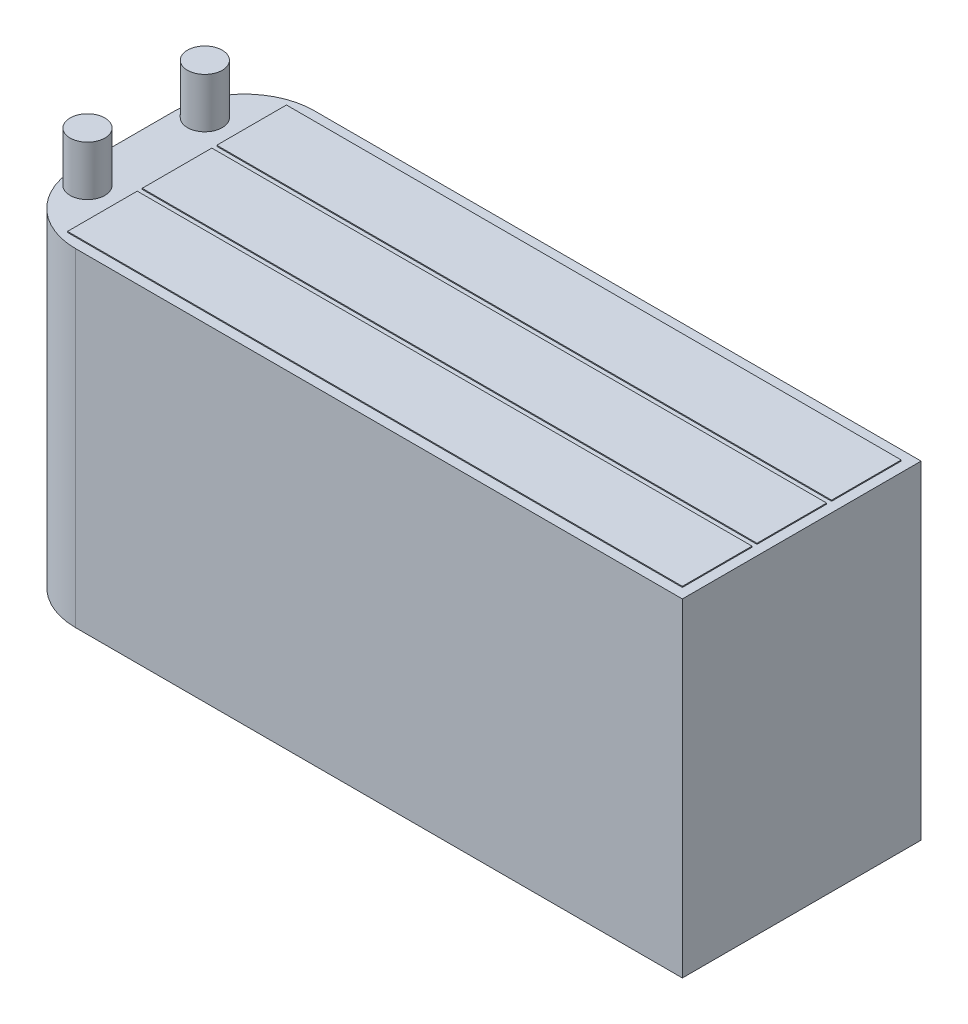
ISO-10303-21;
HEADER;
FILE_DESCRIPTION(('STEP AP214'),'2;1');
FILE_NAME('part.step','',(''),(''),'','','');
FILE_SCHEMA(('AUTOMOTIVE_DESIGN { 1 0 10303 214 1 1 1 1 }'));
ENDSEC;
DATA;
#1=APPLICATION_CONTEXT('core data for automotive mechanical design processes');
#2=APPLICATION_PROTOCOL_DEFINITION('international standard','automotive_design',2000,#1);
#3=PRODUCT_CONTEXT('',#1,'mechanical');
#4=PRODUCT('Part','Part','',(#3));
#5=PRODUCT_RELATED_PRODUCT_CATEGORY('part','',(#4));
#6=PRODUCT_DEFINITION_FORMATION('','',#4);
#7=PRODUCT_DEFINITION_CONTEXT('part definition',#1,'design');
#8=PRODUCT_DEFINITION('design','',#6,#7);
#9=PRODUCT_DEFINITION_SHAPE('','',#8);
#10=(LENGTH_UNIT() NAMED_UNIT(*) SI_UNIT(.MILLI.,.METRE.));
#11=(NAMED_UNIT(*) PLANE_ANGLE_UNIT() SI_UNIT($,.RADIAN.));
#12=(NAMED_UNIT(*) SI_UNIT($,.STERADIAN.) SOLID_ANGLE_UNIT());
#13=UNCERTAINTY_MEASURE_WITH_UNIT(LENGTH_MEASURE(1.E-05),#10,'distance_accuracy_value','');
#14=(GEOMETRIC_REPRESENTATION_CONTEXT(3) GLOBAL_UNCERTAINTY_ASSIGNED_CONTEXT((#13)) GLOBAL_UNIT_ASSIGNED_CONTEXT((#10,
#11,#12)) REPRESENTATION_CONTEXT('',''));
#15=CARTESIAN_POINT('',(0.,0.,0.));
#16=DIRECTION('',(0.,0.,1.));
#17=DIRECTION('',(1.,0.,0.));
#18=AXIS2_PLACEMENT_3D('',#15,#16,#17);
#19=CARTESIAN_POINT('',(33.,-16.6,1.));
#20=DIRECTION('',(-1.,0.,0.));
#21=DIRECTION('',(0.,0.,1.));
#22=AXIS2_PLACEMENT_3D('',#19,#20,#21);
#23=PLANE('',#22);
#24=DIRECTION('',(0.,0.,-1.));
#25=VECTOR('',#24,1.);
#26=CARTESIAN_POINT('',(33.,-16.5,1.));
#27=LINE('',#26,#25);
#28=CARTESIAN_POINT('',(33.,-16.5,8.));
#29=VERTEX_POINT('',#28);
#30=CARTESIAN_POINT('',(33.,-16.5,1.));
#31=VERTEX_POINT('',#30);
#32=EDGE_CURVE('E109',#29,#31,#27,.T.);
#33=ORIENTED_EDGE('',*,*,#32,.F.);
#34=DIRECTION('',(0.,1.,0.));
#35=VECTOR('',#34,1.);
#36=CARTESIAN_POINT('',(33.,-16.6,8.));
#37=LINE('',#36,#35);
#38=CARTESIAN_POINT('',(33.,-16.6,8.));
#39=VERTEX_POINT('',#38);
#40=EDGE_CURVE('E108',#39,#29,#37,.T.);
#41=ORIENTED_EDGE('',*,*,#40,.F.);
#42=DIRECTION('',(0.,0.,-1.));
#43=VECTOR('',#42,1.);
#44=CARTESIAN_POINT('',(33.,-16.6,1.));
#45=LINE('',#44,#43);
#46=CARTESIAN_POINT('',(33.,-16.6,1.));
#47=VERTEX_POINT('',#46);
#48=EDGE_CURVE('E103',#39,#47,#45,.T.);
#49=ORIENTED_EDGE('',*,*,#48,.T.);
#50=DIRECTION('',(0.,1.,0.));
#51=VECTOR('',#50,1.);
#52=CARTESIAN_POINT('',(33.,-16.6,1.));
#53=LINE('',#52,#51);
#54=EDGE_CURVE('E12',#47,#31,#53,.T.);
#55=ORIENTED_EDGE('',*,*,#54,.T.);
#56=EDGE_LOOP('',(#33,#41,#49,#55));
#57=FACE_BOUND('',#56,.T.);
#58=ADVANCED_FACE('F46',(#57),#23,.F.);
#59=CARTESIAN_POINT('',(33.,-16.6,1.));
#60=DIRECTION('',(0.,0.,1.));
#61=DIRECTION('',(1.,0.,0.));
#62=AXIS2_PLACEMENT_3D('',#59,#60,#61);
#63=PLANE('',#62);
#64=DIRECTION('',(-1.,0.,0.));
#65=VECTOR('',#64,1.);
#66=CARTESIAN_POINT('',(33.,-16.5,1.));
#67=LINE('',#66,#65);
#68=CARTESIAN_POINT('',(-28.7999999999999,-16.5,1.));
#69=VERTEX_POINT('',#68);
#70=EDGE_CURVE('E111',#31,#69,#67,.T.);
#71=ORIENTED_EDGE('',*,*,#70,.F.);
#72=ORIENTED_EDGE('',*,*,#54,.F.);
#73=DIRECTION('',(-1.,0.,0.));
#74=VECTOR('',#73,1.);
#75=CARTESIAN_POINT('',(33.,-16.6,1.));
#76=LINE('',#75,#74);
#77=CARTESIAN_POINT('',(-28.7999999999999,-16.6,1.));
#78=VERTEX_POINT('',#77);
#79=EDGE_CURVE('E87',#47,#78,#76,.T.);
#80=ORIENTED_EDGE('',*,*,#79,.T.);
#81=DIRECTION('',(0.,1.,0.));
#82=VECTOR('',#81,1.);
#83=CARTESIAN_POINT('',(-28.7999999999999,-16.6,1.));
#84=LINE('',#83,#82);
#85=EDGE_CURVE('E54',#78,#69,#84,.T.);
#86=ORIENTED_EDGE('',*,*,#85,.T.);
#87=EDGE_LOOP('',(#71,#72,#80,#86));
#88=FACE_BOUND('',#87,.T.);
#89=ADVANCED_FACE('F101',(#88),#63,.F.);
#90=CARTESIAN_POINT('',(-28.7999999999999,-16.6,1.));
#91=DIRECTION('',(1.,0.,0.));
#92=DIRECTION('',(0.,0.,-1.));
#93=AXIS2_PLACEMENT_3D('',#90,#91,#92);
#94=PLANE('',#93);
#95=DIRECTION('',(0.,0.,1.));
#96=VECTOR('',#95,1.);
#97=CARTESIAN_POINT('',(-28.7999999999999,-16.5,1.));
#98=LINE('',#97,#96);
#99=CARTESIAN_POINT('',(-28.7999999999999,-16.5,8.));
#100=VERTEX_POINT('',#99);
#101=EDGE_CURVE('E97',#69,#100,#98,.T.);
#102=ORIENTED_EDGE('',*,*,#101,.F.);
#103=ORIENTED_EDGE('',*,*,#85,.F.);
#104=DIRECTION('',(0.,0.,1.));
#105=VECTOR('',#104,1.);
#106=CARTESIAN_POINT('',(-28.7999999999999,-16.6,1.));
#107=LINE('',#106,#105);
#108=CARTESIAN_POINT('',(-28.7999999999999,-16.6,8.));
#109=VERTEX_POINT('',#108);
#110=EDGE_CURVE('E90',#78,#109,#107,.T.);
#111=ORIENTED_EDGE('',*,*,#110,.T.);
#112=DIRECTION('',(0.,1.,0.));
#113=VECTOR('',#112,1.);
#114=CARTESIAN_POINT('',(-28.7999999999999,-16.6,8.));
#115=LINE('',#114,#113);
#116=EDGE_CURVE('E100',#109,#100,#115,.T.);
#117=ORIENTED_EDGE('',*,*,#116,.T.);
#118=EDGE_LOOP('',(#102,#103,#111,#117));
#119=FACE_BOUND('',#118,.T.);
#120=ADVANCED_FACE('F96',(#119),#94,.F.);
#121=CARTESIAN_POINT('',(33.,-16.6,8.));
#122=DIRECTION('',(0.,0.,-1.));
#123=DIRECTION('',(-1.,0.,0.));
#124=AXIS2_PLACEMENT_3D('',#121,#122,#123);
#125=PLANE('',#124);
#126=DIRECTION('',(1.,0.,0.));
#127=VECTOR('',#126,1.);
#128=CARTESIAN_POINT('',(33.,-16.5,8.));
#129=LINE('',#128,#127);
#130=EDGE_CURVE('E76',#100,#29,#129,.T.);
#131=ORIENTED_EDGE('',*,*,#130,.F.);
#132=ORIENTED_EDGE('',*,*,#116,.F.);
#133=DIRECTION('',(1.,0.,0.));
#134=VECTOR('',#133,1.);
#135=CARTESIAN_POINT('',(33.,-16.6,8.));
#136=LINE('',#135,#134);
#137=EDGE_CURVE('E62',#109,#39,#136,.T.);
#138=ORIENTED_EDGE('',*,*,#137,.T.);
#139=ORIENTED_EDGE('',*,*,#40,.T.);
#140=EDGE_LOOP('',(#131,#132,#138,#139));
#141=FACE_BOUND('',#140,.T.);
#142=ADVANCED_FACE('F120',(#141),#125,.F.);
#143=CARTESIAN_POINT('',(0.,-16.6,0.));
#144=DIRECTION('',(0.,1.,0.));
#145=DIRECTION('',(0.,0.,-1.));
#146=AXIS2_PLACEMENT_3D('',#143,#144,#145);
#147=PLANE('',#146);
#148=ORIENTED_EDGE('',*,*,#48,.F.);
#149=ORIENTED_EDGE('',*,*,#137,.F.);
#150=ORIENTED_EDGE('',*,*,#110,.F.);
#151=ORIENTED_EDGE('',*,*,#79,.F.);
#152=EDGE_LOOP('',(#148,#149,#150,#151));
#153=FACE_BOUND('',#152,.T.);
#154=ADVANCED_FACE('F92',(#153),#147,.F.);
#155=CARTESIAN_POINT('',(0.,-16.5,0.));
#156=DIRECTION('',(0.,1.,0.));
#157=DIRECTION('',(0.,0.,-1.));
#158=AXIS2_PLACEMENT_3D('',#155,#156,#157);
#159=PLANE('',#158);
#160=ORIENTED_EDGE('',*,*,#32,.T.);
#161=ORIENTED_EDGE('',*,*,#70,.T.);
#162=ORIENTED_EDGE('',*,*,#101,.T.);
#163=ORIENTED_EDGE('',*,*,#130,.T.);
#164=EDGE_LOOP('',(#160,#161,#162,#163));
#165=FACE_BOUND('',#164,.T.);
#166=ADVANCED_FACE('F116',(#165),#159,.T.);
#167=CLOSED_SHELL('',(#58,#89,#120,#142,#154,#166));
#168=MANIFOLD_SOLID_BREP('B2',#167);
#169=CARTESIAN_POINT('',(33.,-16.6,8.5));
#170=DIRECTION('',(-1.,0.,0.));
#171=DIRECTION('',(0.,0.,1.));
#172=AXIS2_PLACEMENT_3D('',#169,#170,#171);
#173=PLANE('',#172);
#174=DIRECTION('',(0.,0.,-1.));
#175=VECTOR('',#174,1.);
#176=CARTESIAN_POINT('',(33.,-16.5,8.5));
#177=LINE('',#176,#175);
#178=CARTESIAN_POINT('',(33.,-16.5,15.5));
#179=VERTEX_POINT('',#178);
#180=CARTESIAN_POINT('',(33.,-16.5,8.5));
#181=VERTEX_POINT('',#180);
#182=EDGE_CURVE('E261',#179,#181,#177,.T.);
#183=ORIENTED_EDGE('',*,*,#182,.F.);
#184=DIRECTION('',(0.,1.,0.));
#185=VECTOR('',#184,1.);
#186=CARTESIAN_POINT('',(33.,-16.6,15.5));
#187=LINE('',#186,#185);
#188=CARTESIAN_POINT('',(33.,-16.6,15.5));
#189=VERTEX_POINT('',#188);
#190=EDGE_CURVE('E260',#189,#179,#187,.T.);
#191=ORIENTED_EDGE('',*,*,#190,.F.);
#192=DIRECTION('',(0.,0.,-1.));
#193=VECTOR('',#192,1.);
#194=CARTESIAN_POINT('',(33.,-16.6,8.5));
#195=LINE('',#194,#193);
#196=CARTESIAN_POINT('',(33.,-16.6,8.5));
#197=VERTEX_POINT('',#196);
#198=EDGE_CURVE('E255',#189,#197,#195,.T.);
#199=ORIENTED_EDGE('',*,*,#198,.T.);
#200=DIRECTION('',(0.,1.,0.));
#201=VECTOR('',#200,1.);
#202=CARTESIAN_POINT('',(33.,-16.6,8.5));
#203=LINE('',#202,#201);
#204=EDGE_CURVE('E44',#197,#181,#203,.T.);
#205=ORIENTED_EDGE('',*,*,#204,.T.);
#206=EDGE_LOOP('',(#183,#191,#199,#205));
#207=FACE_BOUND('',#206,.T.);
#208=ADVANCED_FACE('F198',(#207),#173,.F.);
#209=CARTESIAN_POINT('',(33.,-16.6,8.5));
#210=DIRECTION('',(0.,0.,1.));
#211=DIRECTION('',(1.,0.,0.));
#212=AXIS2_PLACEMENT_3D('',#209,#210,#211);
#213=PLANE('',#212);
#214=DIRECTION('',(-1.,0.,0.));
#215=VECTOR('',#214,1.);
#216=CARTESIAN_POINT('',(33.,-16.5,8.5));
#217=LINE('',#216,#215);
#218=CARTESIAN_POINT('',(-28.7999999999999,-16.5,8.5));
#219=VERTEX_POINT('',#218);
#220=EDGE_CURVE('E263',#181,#219,#217,.T.);
#221=ORIENTED_EDGE('',*,*,#220,.F.);
#222=ORIENTED_EDGE('',*,*,#204,.F.);
#223=DIRECTION('',(-1.,0.,0.));
#224=VECTOR('',#223,1.);
#225=CARTESIAN_POINT('',(33.,-16.6,8.5));
#226=LINE('',#225,#224);
#227=CARTESIAN_POINT('',(-28.7999999999999,-16.6,8.5));
#228=VERTEX_POINT('',#227);
#229=EDGE_CURVE('E239',#197,#228,#226,.T.);
#230=ORIENTED_EDGE('',*,*,#229,.T.);
#231=DIRECTION('',(0.,1.,0.));
#232=VECTOR('',#231,1.);
#233=CARTESIAN_POINT('',(-28.7999999999999,-16.6,8.5));
#234=LINE('',#233,#232);
#235=EDGE_CURVE('E206',#228,#219,#234,.T.);
#236=ORIENTED_EDGE('',*,*,#235,.T.);
#237=EDGE_LOOP('',(#221,#222,#230,#236));
#238=FACE_BOUND('',#237,.T.);
#239=ADVANCED_FACE('F253',(#238),#213,.F.);
#240=CARTESIAN_POINT('',(-28.7999999999999,-16.6,8.5));
#241=DIRECTION('',(1.,0.,0.));
#242=DIRECTION('',(0.,0.,-1.));
#243=AXIS2_PLACEMENT_3D('',#240,#241,#242);
#244=PLANE('',#243);
#245=DIRECTION('',(0.,0.,1.));
#246=VECTOR('',#245,1.);
#247=CARTESIAN_POINT('',(-28.7999999999999,-16.5,8.5));
#248=LINE('',#247,#246);
#249=CARTESIAN_POINT('',(-28.7999999999999,-16.5,15.5));
#250=VERTEX_POINT('',#249);
#251=EDGE_CURVE('E249',#219,#250,#248,.T.);
#252=ORIENTED_EDGE('',*,*,#251,.F.);
#253=ORIENTED_EDGE('',*,*,#235,.F.);
#254=DIRECTION('',(0.,0.,1.));
#255=VECTOR('',#254,1.);
#256=CARTESIAN_POINT('',(-28.7999999999999,-16.6,8.5));
#257=LINE('',#256,#255);
#258=CARTESIAN_POINT('',(-28.7999999999999,-16.6,15.5));
#259=VERTEX_POINT('',#258);
#260=EDGE_CURVE('E242',#228,#259,#257,.T.);
#261=ORIENTED_EDGE('',*,*,#260,.T.);
#262=DIRECTION('',(0.,1.,0.));
#263=VECTOR('',#262,1.);
#264=CARTESIAN_POINT('',(-28.7999999999999,-16.6,15.5));
#265=LINE('',#264,#263);
#266=EDGE_CURVE('E252',#259,#250,#265,.T.);
#267=ORIENTED_EDGE('',*,*,#266,.T.);
#268=EDGE_LOOP('',(#252,#253,#261,#267));
#269=FACE_BOUND('',#268,.T.);
#270=ADVANCED_FACE('F248',(#269),#244,.F.);
#271=CARTESIAN_POINT('',(33.,-16.6,15.5));
#272=DIRECTION('',(0.,0.,-1.));
#273=DIRECTION('',(-1.,0.,0.));
#274=AXIS2_PLACEMENT_3D('',#271,#272,#273);
#275=PLANE('',#274);
#276=DIRECTION('',(1.,0.,0.));
#277=VECTOR('',#276,1.);
#278=CARTESIAN_POINT('',(33.,-16.5,15.5));
#279=LINE('',#278,#277);
#280=EDGE_CURVE('E228',#250,#179,#279,.T.);
#281=ORIENTED_EDGE('',*,*,#280,.F.);
#282=ORIENTED_EDGE('',*,*,#266,.F.);
#283=DIRECTION('',(1.,0.,0.));
#284=VECTOR('',#283,1.);
#285=CARTESIAN_POINT('',(33.,-16.6,15.5));
#286=LINE('',#285,#284);
#287=EDGE_CURVE('E214',#259,#189,#286,.T.);
#288=ORIENTED_EDGE('',*,*,#287,.T.);
#289=ORIENTED_EDGE('',*,*,#190,.T.);
#290=EDGE_LOOP('',(#281,#282,#288,#289));
#291=FACE_BOUND('',#290,.T.);
#292=ADVANCED_FACE('F272',(#291),#275,.F.);
#293=CARTESIAN_POINT('',(0.,-16.6,0.));
#294=DIRECTION('',(0.,1.,0.));
#295=DIRECTION('',(0.,0.,-1.));
#296=AXIS2_PLACEMENT_3D('',#293,#294,#295);
#297=PLANE('',#296);
#298=ORIENTED_EDGE('',*,*,#198,.F.);
#299=ORIENTED_EDGE('',*,*,#287,.F.);
#300=ORIENTED_EDGE('',*,*,#260,.F.);
#301=ORIENTED_EDGE('',*,*,#229,.F.);
#302=EDGE_LOOP('',(#298,#299,#300,#301));
#303=FACE_BOUND('',#302,.T.);
#304=ADVANCED_FACE('F244',(#303),#297,.F.);
#305=CARTESIAN_POINT('',(0.,-16.5,0.));
#306=DIRECTION('',(0.,1.,0.));
#307=DIRECTION('',(0.,0.,-1.));
#308=AXIS2_PLACEMENT_3D('',#305,#306,#307);
#309=PLANE('',#308);
#310=ORIENTED_EDGE('',*,*,#182,.T.);
#311=ORIENTED_EDGE('',*,*,#220,.T.);
#312=ORIENTED_EDGE('',*,*,#251,.T.);
#313=ORIENTED_EDGE('',*,*,#280,.T.);
#314=EDGE_LOOP('',(#310,#311,#312,#313));
#315=FACE_BOUND('',#314,.T.);
#316=ADVANCED_FACE('F268',(#315),#309,.T.);
#317=CLOSED_SHELL('',(#208,#239,#270,#292,#304,#316));
#318=MANIFOLD_SOLID_BREP('B6',#317);
#319=CARTESIAN_POINT('',(-28.7999999999999,-16.6,16.));
#320=DIRECTION('',(1.,0.,0.));
#321=DIRECTION('',(0.,0.,-1.));
#322=AXIS2_PLACEMENT_3D('',#319,#320,#321);
#323=PLANE('',#322);
#324=DIRECTION('',(0.,0.,1.));
#325=VECTOR('',#324,1.);
#326=CARTESIAN_POINT('',(-28.7999999999999,-16.5,16.));
#327=LINE('',#326,#325);
#328=CARTESIAN_POINT('',(-28.7999999999999,-16.5,16.));
#329=VERTEX_POINT('',#328);
#330=CARTESIAN_POINT('',(-28.7999999999999,-16.5,23.));
#331=VERTEX_POINT('',#330);
#332=EDGE_CURVE('E413',#329,#331,#327,.T.);
#333=ORIENTED_EDGE('',*,*,#332,.F.);
#334=DIRECTION('',(0.,1.,0.));
#335=VECTOR('',#334,1.);
#336=CARTESIAN_POINT('',(-28.7999999999999,-16.6,16.));
#337=LINE('',#336,#335);
#338=CARTESIAN_POINT('',(-28.7999999999999,-16.6,16.));
#339=VERTEX_POINT('',#338);
#340=EDGE_CURVE('E412',#339,#329,#337,.T.);
#341=ORIENTED_EDGE('',*,*,#340,.F.);
#342=DIRECTION('',(0.,0.,1.));
#343=VECTOR('',#342,1.);
#344=CARTESIAN_POINT('',(-28.7999999999999,-16.6,16.));
#345=LINE('',#344,#343);
#346=CARTESIAN_POINT('',(-28.7999999999999,-16.6,23.));
#347=VERTEX_POINT('',#346);
#348=EDGE_CURVE('E407',#339,#347,#345,.T.);
#349=ORIENTED_EDGE('',*,*,#348,.T.);
#350=DIRECTION('',(0.,1.,0.));
#351=VECTOR('',#350,1.);
#352=CARTESIAN_POINT('',(-28.7999999999999,-16.6,23.));
#353=LINE('',#352,#351);
#354=EDGE_CURVE('E196',#347,#331,#353,.T.);
#355=ORIENTED_EDGE('',*,*,#354,.T.);
#356=EDGE_LOOP('',(#333,#341,#349,#355));
#357=FACE_BOUND('',#356,.T.);
#358=ADVANCED_FACE('F350',(#357),#323,.F.);
#359=CARTESIAN_POINT('',(-28.7999999999999,-16.6,23.));
#360=DIRECTION('',(0.,0.,-1.));
#361=DIRECTION('',(-1.,0.,0.));
#362=AXIS2_PLACEMENT_3D('',#359,#360,#361);
#363=PLANE('',#362);
#364=DIRECTION('',(1.,0.,0.));
#365=VECTOR('',#364,1.);
#366=CARTESIAN_POINT('',(-28.7999999999999,-16.5,23.));
#367=LINE('',#366,#365);
#368=CARTESIAN_POINT('',(33.,-16.5,23.));
#369=VERTEX_POINT('',#368);
#370=EDGE_CURVE('E415',#331,#369,#367,.T.);
#371=ORIENTED_EDGE('',*,*,#370,.F.);
#372=ORIENTED_EDGE('',*,*,#354,.F.);
#373=DIRECTION('',(1.,0.,0.));
#374=VECTOR('',#373,1.);
#375=CARTESIAN_POINT('',(-28.7999999999999,-16.6,23.));
#376=LINE('',#375,#374);
#377=CARTESIAN_POINT('',(33.,-16.6,23.));
#378=VERTEX_POINT('',#377);
#379=EDGE_CURVE('E391',#347,#378,#376,.T.);
#380=ORIENTED_EDGE('',*,*,#379,.T.);
#381=DIRECTION('',(0.,1.,0.));
#382=VECTOR('',#381,1.);
#383=CARTESIAN_POINT('',(33.,-16.6,23.));
#384=LINE('',#383,#382);
#385=EDGE_CURVE('E358',#378,#369,#384,.T.);
#386=ORIENTED_EDGE('',*,*,#385,.T.);
#387=EDGE_LOOP('',(#371,#372,#380,#386));
#388=FACE_BOUND('',#387,.T.);
#389=ADVANCED_FACE('F405',(#388),#363,.F.);
#390=CARTESIAN_POINT('',(33.,-16.6,16.));
#391=DIRECTION('',(-1.,0.,0.));
#392=DIRECTION('',(0.,0.,1.));
#393=AXIS2_PLACEMENT_3D('',#390,#391,#392);
#394=PLANE('',#393);
#395=DIRECTION('',(0.,0.,-1.));
#396=VECTOR('',#395,1.);
#397=CARTESIAN_POINT('',(33.,-16.5,16.));
#398=LINE('',#397,#396);
#399=CARTESIAN_POINT('',(33.,-16.5,16.));
#400=VERTEX_POINT('',#399);
#401=EDGE_CURVE('E401',#369,#400,#398,.T.);
#402=ORIENTED_EDGE('',*,*,#401,.F.);
#403=ORIENTED_EDGE('',*,*,#385,.F.);
#404=DIRECTION('',(0.,0.,-1.));
#405=VECTOR('',#404,1.);
#406=CARTESIAN_POINT('',(33.,-16.6,16.));
#407=LINE('',#406,#405);
#408=CARTESIAN_POINT('',(33.,-16.6,16.));
#409=VERTEX_POINT('',#408);
#410=EDGE_CURVE('E394',#378,#409,#407,.T.);
#411=ORIENTED_EDGE('',*,*,#410,.T.);
#412=DIRECTION('',(0.,1.,0.));
#413=VECTOR('',#412,1.);
#414=CARTESIAN_POINT('',(33.,-16.6,16.));
#415=LINE('',#414,#413);
#416=EDGE_CURVE('E404',#409,#400,#415,.T.);
#417=ORIENTED_EDGE('',*,*,#416,.T.);
#418=EDGE_LOOP('',(#402,#403,#411,#417));
#419=FACE_BOUND('',#418,.T.);
#420=ADVANCED_FACE('F400',(#419),#394,.F.);
#421=CARTESIAN_POINT('',(-28.7999999999999,-16.6,16.));
#422=DIRECTION('',(0.,0.,1.));
#423=DIRECTION('',(1.,0.,0.));
#424=AXIS2_PLACEMENT_3D('',#421,#422,#423);
#425=PLANE('',#424);
#426=DIRECTION('',(-1.,0.,0.));
#427=VECTOR('',#426,1.);
#428=CARTESIAN_POINT('',(-28.7999999999999,-16.5,16.));
#429=LINE('',#428,#427);
#430=EDGE_CURVE('E380',#400,#329,#429,.T.);
#431=ORIENTED_EDGE('',*,*,#430,.F.);
#432=ORIENTED_EDGE('',*,*,#416,.F.);
#433=DIRECTION('',(-1.,0.,0.));
#434=VECTOR('',#433,1.);
#435=CARTESIAN_POINT('',(-28.7999999999999,-16.6,16.));
#436=LINE('',#435,#434);
#437=EDGE_CURVE('E366',#409,#339,#436,.T.);
#438=ORIENTED_EDGE('',*,*,#437,.T.);
#439=ORIENTED_EDGE('',*,*,#340,.T.);
#440=EDGE_LOOP('',(#431,#432,#438,#439));
#441=FACE_BOUND('',#440,.T.);
#442=ADVANCED_FACE('F424',(#441),#425,.F.);
#443=CARTESIAN_POINT('',(0.,-16.6,0.));
#444=DIRECTION('',(0.,-1.,0.));
#445=DIRECTION('',(0.,0.,1.));
#446=AXIS2_PLACEMENT_3D('',#443,#444,#445);
#447=PLANE('',#446);
#448=ORIENTED_EDGE('',*,*,#348,.F.);
#449=ORIENTED_EDGE('',*,*,#437,.F.);
#450=ORIENTED_EDGE('',*,*,#410,.F.);
#451=ORIENTED_EDGE('',*,*,#379,.F.);
#452=EDGE_LOOP('',(#448,#449,#450,#451));
#453=FACE_BOUND('',#452,.T.);
#454=ADVANCED_FACE('F396',(#453),#447,.T.);
#455=CARTESIAN_POINT('',(0.,-16.5,0.));
#456=DIRECTION('',(0.,-1.,0.));
#457=DIRECTION('',(0.,0.,1.));
#458=AXIS2_PLACEMENT_3D('',#455,#456,#457);
#459=PLANE('',#458);
#460=ORIENTED_EDGE('',*,*,#332,.T.);
#461=ORIENTED_EDGE('',*,*,#370,.T.);
#462=ORIENTED_EDGE('',*,*,#401,.T.);
#463=ORIENTED_EDGE('',*,*,#430,.T.);
#464=EDGE_LOOP('',(#460,#461,#462,#463));
#465=FACE_BOUND('',#464,.T.);
#466=ADVANCED_FACE('F420',(#465),#459,.F.);
#467=CLOSED_SHELL('',(#358,#389,#420,#442,#454,#466));
#468=MANIFOLD_SOLID_BREP('B38',#467);
#469=CARTESIAN_POINT('',(-28.7999999999999,16.6,16.));
#470=DIRECTION('',(1.,0.,0.));
#471=DIRECTION('',(0.,0.,-1.));
#472=AXIS2_PLACEMENT_3D('',#469,#470,#471);
#473=PLANE('',#472);
#474=DIRECTION('',(0.,0.,1.));
#475=VECTOR('',#474,1.);
#476=CARTESIAN_POINT('',(-28.7999999999999,16.5,16.));
#477=LINE('',#476,#475);
#478=CARTESIAN_POINT('',(-28.7999999999999,16.5,16.));
#479=VERTEX_POINT('',#478);
#480=CARTESIAN_POINT('',(-28.7999999999999,16.5,23.));
#481=VERTEX_POINT('',#480);
#482=EDGE_CURVE('E565',#479,#481,#477,.T.);
#483=ORIENTED_EDGE('',*,*,#482,.T.);
#484=DIRECTION('',(0.,-1.,0.));
#485=VECTOR('',#484,1.);
#486=CARTESIAN_POINT('',(-28.7999999999999,16.6,23.));
#487=LINE('',#486,#485);
#488=CARTESIAN_POINT('',(-28.7999999999999,16.6,23.));
#489=VERTEX_POINT('',#488);
#490=EDGE_CURVE('E348',#489,#481,#487,.T.);
#491=ORIENTED_EDGE('',*,*,#490,.F.);
#492=DIRECTION('',(0.,0.,1.));
#493=VECTOR('',#492,1.);
#494=CARTESIAN_POINT('',(-28.7999999999999,16.6,16.));
#495=LINE('',#494,#493);
#496=CARTESIAN_POINT('',(-28.7999999999999,16.6,16.));
#497=VERTEX_POINT('',#496);
#498=EDGE_CURVE('E553',#497,#489,#495,.T.);
#499=ORIENTED_EDGE('',*,*,#498,.F.);
#500=DIRECTION('',(0.,-1.,0.));
#501=VECTOR('',#500,1.);
#502=CARTESIAN_POINT('',(-28.7999999999999,16.6,16.));
#503=LINE('',#502,#501);
#504=EDGE_CURVE('E561',#497,#479,#503,.T.);
#505=ORIENTED_EDGE('',*,*,#504,.T.);
#506=EDGE_LOOP('',(#483,#491,#499,#505));
#507=FACE_BOUND('',#506,.T.);
#508=ADVANCED_FACE('F502',(#507),#473,.F.);
#509=CARTESIAN_POINT('',(-28.7999999999999,16.6,23.));
#510=DIRECTION('',(0.,0.,-1.));
#511=DIRECTION('',(-1.,0.,0.));
#512=AXIS2_PLACEMENT_3D('',#509,#510,#511);
#513=PLANE('',#512);
#514=DIRECTION('',(1.,0.,0.));
#515=VECTOR('',#514,1.);
#516=CARTESIAN_POINT('',(-28.7999999999999,16.5,23.));
#517=LINE('',#516,#515);
#518=CARTESIAN_POINT('',(33.,16.5,23.));
#519=VERTEX_POINT('',#518);
#520=EDGE_CURVE('E557',#481,#519,#517,.T.);
#521=ORIENTED_EDGE('',*,*,#520,.T.);
#522=DIRECTION('',(0.,-1.,0.));
#523=VECTOR('',#522,1.);
#524=CARTESIAN_POINT('',(33.,16.6,23.));
#525=LINE('',#524,#523);
#526=CARTESIAN_POINT('',(33.,16.6,23.));
#527=VERTEX_POINT('',#526);
#528=EDGE_CURVE('E510',#527,#519,#525,.T.);
#529=ORIENTED_EDGE('',*,*,#528,.F.);
#530=DIRECTION('',(1.,0.,0.));
#531=VECTOR('',#530,1.);
#532=CARTESIAN_POINT('',(-28.7999999999999,16.6,23.));
#533=LINE('',#532,#531);
#534=EDGE_CURVE('E548',#489,#527,#533,.T.);
#535=ORIENTED_EDGE('',*,*,#534,.F.);
#536=ORIENTED_EDGE('',*,*,#490,.T.);
#537=EDGE_LOOP('',(#521,#529,#535,#536));
#538=FACE_BOUND('',#537,.T.);
#539=ADVANCED_FACE('F556',(#538),#513,.F.);
#540=CARTESIAN_POINT('',(33.,16.6,16.));
#541=DIRECTION('',(-1.,0.,0.));
#542=DIRECTION('',(0.,0.,1.));
#543=AXIS2_PLACEMENT_3D('',#540,#541,#542);
#544=PLANE('',#543);
#545=DIRECTION('',(0.,0.,-1.));
#546=VECTOR('',#545,1.);
#547=CARTESIAN_POINT('',(33.,16.5,16.));
#548=LINE('',#547,#546);
#549=CARTESIAN_POINT('',(33.,16.5,16.));
#550=VERTEX_POINT('',#549);
#551=EDGE_CURVE('E535',#519,#550,#548,.T.);
#552=ORIENTED_EDGE('',*,*,#551,.T.);
#553=DIRECTION('',(0.,-1.,0.));
#554=VECTOR('',#553,1.);
#555=CARTESIAN_POINT('',(33.,16.6,16.));
#556=LINE('',#555,#554);
#557=CARTESIAN_POINT('',(33.,16.6,16.));
#558=VERTEX_POINT('',#557);
#559=EDGE_CURVE('E558',#558,#550,#556,.T.);
#560=ORIENTED_EDGE('',*,*,#559,.F.);
#561=DIRECTION('',(0.,0.,-1.));
#562=VECTOR('',#561,1.);
#563=CARTESIAN_POINT('',(33.,16.6,16.));
#564=LINE('',#563,#562);
#565=EDGE_CURVE('E551',#527,#558,#564,.T.);
#566=ORIENTED_EDGE('',*,*,#565,.F.);
#567=ORIENTED_EDGE('',*,*,#528,.T.);
#568=EDGE_LOOP('',(#552,#560,#566,#567));
#569=FACE_BOUND('',#568,.T.);
#570=ADVANCED_FACE('F559',(#569),#544,.F.);
#571=CARTESIAN_POINT('',(-28.7999999999999,16.6,16.));
#572=DIRECTION('',(0.,0.,1.));
#573=DIRECTION('',(1.,0.,0.));
#574=AXIS2_PLACEMENT_3D('',#571,#572,#573);
#575=PLANE('',#574);
#576=DIRECTION('',(-1.,0.,0.));
#577=VECTOR('',#576,1.);
#578=CARTESIAN_POINT('',(-28.7999999999999,16.5,16.));
#579=LINE('',#578,#577);
#580=EDGE_CURVE('E541',#550,#479,#579,.T.);
#581=ORIENTED_EDGE('',*,*,#580,.T.);
#582=ORIENTED_EDGE('',*,*,#504,.F.);
#583=DIRECTION('',(-1.,0.,0.));
#584=VECTOR('',#583,1.);
#585=CARTESIAN_POINT('',(-28.7999999999999,16.6,16.));
#586=LINE('',#585,#584);
#587=EDGE_CURVE('E518',#558,#497,#586,.T.);
#588=ORIENTED_EDGE('',*,*,#587,.F.);
#589=ORIENTED_EDGE('',*,*,#559,.T.);
#590=EDGE_LOOP('',(#581,#582,#588,#589));
#591=FACE_BOUND('',#590,.T.);
#592=ADVANCED_FACE('F572',(#591),#575,.F.);
#593=CARTESIAN_POINT('',(0.,16.6,0.));
#594=DIRECTION('',(0.,1.,0.));
#595=DIRECTION('',(0.,0.,1.));
#596=AXIS2_PLACEMENT_3D('',#593,#594,#595);
#597=PLANE('',#596);
#598=ORIENTED_EDGE('',*,*,#498,.T.);
#599=ORIENTED_EDGE('',*,*,#534,.T.);
#600=ORIENTED_EDGE('',*,*,#565,.T.);
#601=ORIENTED_EDGE('',*,*,#587,.T.);
#602=EDGE_LOOP('',(#598,#599,#600,#601));
#603=FACE_BOUND('',#602,.T.);
#604=ADVANCED_FACE('F549',(#603),#597,.T.);
#605=CARTESIAN_POINT('',(0.,16.5,0.));
#606=DIRECTION('',(0.,1.,0.));
#607=DIRECTION('',(0.,0.,1.));
#608=AXIS2_PLACEMENT_3D('',#605,#606,#607);
#609=PLANE('',#608);
#610=ORIENTED_EDGE('',*,*,#482,.F.);
#611=ORIENTED_EDGE('',*,*,#580,.F.);
#612=ORIENTED_EDGE('',*,*,#551,.F.);
#613=ORIENTED_EDGE('',*,*,#520,.F.);
#614=EDGE_LOOP('',(#610,#611,#612,#613));
#615=FACE_BOUND('',#614,.T.);
#616=ADVANCED_FACE('F575',(#615),#609,.F.);
#617=CLOSED_SHELL('',(#508,#539,#570,#592,#604,#616));
#618=MANIFOLD_SOLID_BREP('B190',#617);
#619=CARTESIAN_POINT('',(33.,16.6,8.5));
#620=DIRECTION('',(-1.,0.,0.));
#621=DIRECTION('',(0.,0.,1.));
#622=AXIS2_PLACEMENT_3D('',#619,#620,#621);
#623=PLANE('',#622);
#624=DIRECTION('',(0.,0.,-1.));
#625=VECTOR('',#624,1.);
#626=CARTESIAN_POINT('',(33.,16.5,8.5));
#627=LINE('',#626,#625);
#628=CARTESIAN_POINT('',(33.,16.5,15.5));
#629=VERTEX_POINT('',#628);
#630=CARTESIAN_POINT('',(33.,16.5,8.5));
#631=VERTEX_POINT('',#630);
#632=EDGE_CURVE('E719',#629,#631,#627,.T.);
#633=ORIENTED_EDGE('',*,*,#632,.T.);
#634=DIRECTION('',(0.,-1.,0.));
#635=VECTOR('',#634,1.);
#636=CARTESIAN_POINT('',(33.,16.6,8.5));
#637=LINE('',#636,#635);
#638=CARTESIAN_POINT('',(33.,16.6,8.5));
#639=VERTEX_POINT('',#638);
#640=EDGE_CURVE('E500',#639,#631,#637,.T.);
#641=ORIENTED_EDGE('',*,*,#640,.F.);
#642=DIRECTION('',(0.,0.,-1.));
#643=VECTOR('',#642,1.);
#644=CARTESIAN_POINT('',(33.,16.6,8.5));
#645=LINE('',#644,#643);
#646=CARTESIAN_POINT('',(33.,16.6,15.5));
#647=VERTEX_POINT('',#646);
#648=EDGE_CURVE('E707',#647,#639,#645,.T.);
#649=ORIENTED_EDGE('',*,*,#648,.F.);
#650=DIRECTION('',(0.,-1.,0.));
#651=VECTOR('',#650,1.);
#652=CARTESIAN_POINT('',(33.,16.6,15.5));
#653=LINE('',#652,#651);
#654=EDGE_CURVE('E715',#647,#629,#653,.T.);
#655=ORIENTED_EDGE('',*,*,#654,.T.);
#656=EDGE_LOOP('',(#633,#641,#649,#655));
#657=FACE_BOUND('',#656,.T.);
#658=ADVANCED_FACE('F656',(#657),#623,.F.);
#659=CARTESIAN_POINT('',(33.,16.6,8.5));
#660=DIRECTION('',(0.,0.,1.));
#661=DIRECTION('',(1.,0.,0.));
#662=AXIS2_PLACEMENT_3D('',#659,#660,#661);
#663=PLANE('',#662);
#664=DIRECTION('',(-1.,0.,0.));
#665=VECTOR('',#664,1.);
#666=CARTESIAN_POINT('',(33.,16.5,8.5));
#667=LINE('',#666,#665);
#668=CARTESIAN_POINT('',(-28.7999999999999,16.5,8.5));
#669=VERTEX_POINT('',#668);
#670=EDGE_CURVE('E711',#631,#669,#667,.T.);
#671=ORIENTED_EDGE('',*,*,#670,.T.);
#672=DIRECTION('',(0.,-1.,0.));
#673=VECTOR('',#672,1.);
#674=CARTESIAN_POINT('',(-28.7999999999999,16.6,8.5));
#675=LINE('',#674,#673);
#676=CARTESIAN_POINT('',(-28.7999999999999,16.6,8.5));
#677=VERTEX_POINT('',#676);
#678=EDGE_CURVE('E664',#677,#669,#675,.T.);
#679=ORIENTED_EDGE('',*,*,#678,.F.);
#680=DIRECTION('',(-1.,0.,0.));
#681=VECTOR('',#680,1.);
#682=CARTESIAN_POINT('',(33.,16.6,8.5));
#683=LINE('',#682,#681);
#684=EDGE_CURVE('E702',#639,#677,#683,.T.);
#685=ORIENTED_EDGE('',*,*,#684,.F.);
#686=ORIENTED_EDGE('',*,*,#640,.T.);
#687=EDGE_LOOP('',(#671,#679,#685,#686));
#688=FACE_BOUND('',#687,.T.);
#689=ADVANCED_FACE('F710',(#688),#663,.F.);
#690=CARTESIAN_POINT('',(-28.7999999999999,16.6,8.5));
#691=DIRECTION('',(1.,0.,0.));
#692=DIRECTION('',(0.,0.,-1.));
#693=AXIS2_PLACEMENT_3D('',#690,#691,#692);
#694=PLANE('',#693);
#695=DIRECTION('',(0.,0.,1.));
#696=VECTOR('',#695,1.);
#697=CARTESIAN_POINT('',(-28.7999999999999,16.5,8.5));
#698=LINE('',#697,#696);
#699=CARTESIAN_POINT('',(-28.7999999999999,16.5,15.5));
#700=VERTEX_POINT('',#699);
#701=EDGE_CURVE('E689',#669,#700,#698,.T.);
#702=ORIENTED_EDGE('',*,*,#701,.T.);
#703=DIRECTION('',(0.,-1.,0.));
#704=VECTOR('',#703,1.);
#705=CARTESIAN_POINT('',(-28.7999999999999,16.6,15.5));
#706=LINE('',#705,#704);
#707=CARTESIAN_POINT('',(-28.7999999999999,16.6,15.5));
#708=VERTEX_POINT('',#707);
#709=EDGE_CURVE('E712',#708,#700,#706,.T.);
#710=ORIENTED_EDGE('',*,*,#709,.F.);
#711=DIRECTION('',(0.,0.,1.));
#712=VECTOR('',#711,1.);
#713=CARTESIAN_POINT('',(-28.7999999999999,16.6,8.5));
#714=LINE('',#713,#712);
#715=EDGE_CURVE('E705',#677,#708,#714,.T.);
#716=ORIENTED_EDGE('',*,*,#715,.F.);
#717=ORIENTED_EDGE('',*,*,#678,.T.);
#718=EDGE_LOOP('',(#702,#710,#716,#717));
#719=FACE_BOUND('',#718,.T.);
#720=ADVANCED_FACE('F713',(#719),#694,.F.);
#721=CARTESIAN_POINT('',(33.,16.6,15.5));
#722=DIRECTION('',(0.,0.,-1.));
#723=DIRECTION('',(-1.,0.,0.));
#724=AXIS2_PLACEMENT_3D('',#721,#722,#723);
#725=PLANE('',#724);
#726=DIRECTION('',(1.,0.,0.));
#727=VECTOR('',#726,1.);
#728=CARTESIAN_POINT('',(33.,16.5,15.5));
#729=LINE('',#728,#727);
#730=EDGE_CURVE('E695',#700,#629,#729,.T.);
#731=ORIENTED_EDGE('',*,*,#730,.T.);
#732=ORIENTED_EDGE('',*,*,#654,.F.);
#733=DIRECTION('',(1.,0.,0.));
#734=VECTOR('',#733,1.);
#735=CARTESIAN_POINT('',(33.,16.6,15.5));
#736=LINE('',#735,#734);
#737=EDGE_CURVE('E672',#708,#647,#736,.T.);
#738=ORIENTED_EDGE('',*,*,#737,.F.);
#739=ORIENTED_EDGE('',*,*,#709,.T.);
#740=EDGE_LOOP('',(#731,#732,#738,#739));
#741=FACE_BOUND('',#740,.T.);
#742=ADVANCED_FACE('F726',(#741),#725,.F.);
#743=CARTESIAN_POINT('',(0.,16.6,0.));
#744=DIRECTION('',(0.,-1.,0.));
#745=DIRECTION('',(0.,0.,-1.));
#746=AXIS2_PLACEMENT_3D('',#743,#744,#745);
#747=PLANE('',#746);
#748=ORIENTED_EDGE('',*,*,#648,.T.);
#749=ORIENTED_EDGE('',*,*,#684,.T.);
#750=ORIENTED_EDGE('',*,*,#715,.T.);
#751=ORIENTED_EDGE('',*,*,#737,.T.);
#752=EDGE_LOOP('',(#748,#749,#750,#751));
#753=FACE_BOUND('',#752,.T.);
#754=ADVANCED_FACE('F703',(#753),#747,.F.);
#755=CARTESIAN_POINT('',(0.,16.5,0.));
#756=DIRECTION('',(0.,-1.,0.));
#757=DIRECTION('',(0.,0.,-1.));
#758=AXIS2_PLACEMENT_3D('',#755,#756,#757);
#759=PLANE('',#758);
#760=ORIENTED_EDGE('',*,*,#632,.F.);
#761=ORIENTED_EDGE('',*,*,#730,.F.);
#762=ORIENTED_EDGE('',*,*,#701,.F.);
#763=ORIENTED_EDGE('',*,*,#670,.F.);
#764=EDGE_LOOP('',(#760,#761,#762,#763));
#765=FACE_BOUND('',#764,.T.);
#766=ADVANCED_FACE('F729',(#765),#759,.T.);
#767=CLOSED_SHELL('',(#658,#689,#720,#742,#754,#766));
#768=MANIFOLD_SOLID_BREP('B342',#767);
#769=CARTESIAN_POINT('',(33.,16.6,1.));
#770=DIRECTION('',(-1.,0.,0.));
#771=DIRECTION('',(0.,0.,1.));
#772=AXIS2_PLACEMENT_3D('',#769,#770,#771);
#773=PLANE('',#772);
#774=DIRECTION('',(0.,0.,-1.));
#775=VECTOR('',#774,1.);
#776=CARTESIAN_POINT('',(33.,16.5,1.));
#777=LINE('',#776,#775);
#778=CARTESIAN_POINT('',(33.,16.5,8.));
#779=VERTEX_POINT('',#778);
#780=CARTESIAN_POINT('',(33.,16.5,1.));
#781=VERTEX_POINT('',#780);
#782=EDGE_CURVE('E872',#779,#781,#777,.T.);
#783=ORIENTED_EDGE('',*,*,#782,.T.);
#784=DIRECTION('',(0.,-1.,0.));
#785=VECTOR('',#784,1.);
#786=CARTESIAN_POINT('',(33.,16.6,1.));
#787=LINE('',#786,#785);
#788=CARTESIAN_POINT('',(33.,16.6,1.));
#789=VERTEX_POINT('',#788);
#790=EDGE_CURVE('E654',#789,#781,#787,.T.);
#791=ORIENTED_EDGE('',*,*,#790,.F.);
#792=DIRECTION('',(0.,0.,-1.));
#793=VECTOR('',#792,1.);
#794=CARTESIAN_POINT('',(33.,16.6,1.));
#795=LINE('',#794,#793);
#796=CARTESIAN_POINT('',(33.,16.6,8.));
#797=VERTEX_POINT('',#796);
#798=EDGE_CURVE('E860',#797,#789,#795,.T.);
#799=ORIENTED_EDGE('',*,*,#798,.F.);
#800=DIRECTION('',(0.,-1.,0.));
#801=VECTOR('',#800,1.);
#802=CARTESIAN_POINT('',(33.,16.6,8.));
#803=LINE('',#802,#801);
#804=EDGE_CURVE('E868',#797,#779,#803,.T.);
#805=ORIENTED_EDGE('',*,*,#804,.T.);
#806=EDGE_LOOP('',(#783,#791,#799,#805));
#807=FACE_BOUND('',#806,.T.);
#808=ADVANCED_FACE('F809',(#807),#773,.F.);
#809=CARTESIAN_POINT('',(33.,16.6,1.));
#810=DIRECTION('',(0.,0.,1.));
#811=DIRECTION('',(1.,0.,0.));
#812=AXIS2_PLACEMENT_3D('',#809,#810,#811);
#813=PLANE('',#812);
#814=DIRECTION('',(-1.,0.,0.));
#815=VECTOR('',#814,1.);
#816=CARTESIAN_POINT('',(33.,16.5,1.));
#817=LINE('',#816,#815);
#818=CARTESIAN_POINT('',(-28.7999999999999,16.5,1.));
#819=VERTEX_POINT('',#818);
#820=EDGE_CURVE('E864',#781,#819,#817,.T.);
#821=ORIENTED_EDGE('',*,*,#820,.T.);
#822=DIRECTION('',(0.,-1.,0.));
#823=VECTOR('',#822,1.);
#824=CARTESIAN_POINT('',(-28.7999999999999,16.6,1.));
#825=LINE('',#824,#823);
#826=CARTESIAN_POINT('',(-28.7999999999999,16.6,1.));
#827=VERTEX_POINT('',#826);
#828=EDGE_CURVE('E817',#827,#819,#825,.T.);
#829=ORIENTED_EDGE('',*,*,#828,.F.);
#830=DIRECTION('',(-1.,0.,0.));
#831=VECTOR('',#830,1.);
#832=CARTESIAN_POINT('',(33.,16.6,1.));
#833=LINE('',#832,#831);
#834=EDGE_CURVE('E855',#789,#827,#833,.T.);
#835=ORIENTED_EDGE('',*,*,#834,.F.);
#836=ORIENTED_EDGE('',*,*,#790,.T.);
#837=EDGE_LOOP('',(#821,#829,#835,#836));
#838=FACE_BOUND('',#837,.T.);
#839=ADVANCED_FACE('F863',(#838),#813,.F.);
#840=CARTESIAN_POINT('',(-28.7999999999999,16.6,1.));
#841=DIRECTION('',(1.,0.,0.));
#842=DIRECTION('',(0.,0.,-1.));
#843=AXIS2_PLACEMENT_3D('',#840,#841,#842);
#844=PLANE('',#843);
#845=DIRECTION('',(0.,0.,1.));
#846=VECTOR('',#845,1.);
#847=CARTESIAN_POINT('',(-28.7999999999999,16.5,1.));
#848=LINE('',#847,#846);
#849=CARTESIAN_POINT('',(-28.7999999999999,16.5,8.));
#850=VERTEX_POINT('',#849);
#851=EDGE_CURVE('E842',#819,#850,#848,.T.);
#852=ORIENTED_EDGE('',*,*,#851,.T.);
#853=DIRECTION('',(0.,-1.,0.));
#854=VECTOR('',#853,1.);
#855=CARTESIAN_POINT('',(-28.7999999999999,16.6,8.));
#856=LINE('',#855,#854);
#857=CARTESIAN_POINT('',(-28.7999999999999,16.6,8.));
#858=VERTEX_POINT('',#857);
#859=EDGE_CURVE('E865',#858,#850,#856,.T.);
#860=ORIENTED_EDGE('',*,*,#859,.F.);
#861=DIRECTION('',(0.,0.,1.));
#862=VECTOR('',#861,1.);
#863=CARTESIAN_POINT('',(-28.7999999999999,16.6,1.));
#864=LINE('',#863,#862);
#865=EDGE_CURVE('E858',#827,#858,#864,.T.);
#866=ORIENTED_EDGE('',*,*,#865,.F.);
#867=ORIENTED_EDGE('',*,*,#828,.T.);
#868=EDGE_LOOP('',(#852,#860,#866,#867));
#869=FACE_BOUND('',#868,.T.);
#870=ADVANCED_FACE('F866',(#869),#844,.F.);
#871=CARTESIAN_POINT('',(33.,16.6,8.));
#872=DIRECTION('',(0.,0.,-1.));
#873=DIRECTION('',(-1.,0.,0.));
#874=AXIS2_PLACEMENT_3D('',#871,#872,#873);
#875=PLANE('',#874);
#876=DIRECTION('',(1.,0.,0.));
#877=VECTOR('',#876,1.);
#878=CARTESIAN_POINT('',(33.,16.5,8.));
#879=LINE('',#878,#877);
#880=EDGE_CURVE('E848',#850,#779,#879,.T.);
#881=ORIENTED_EDGE('',*,*,#880,.T.);
#882=ORIENTED_EDGE('',*,*,#804,.F.);
#883=DIRECTION('',(1.,0.,0.));
#884=VECTOR('',#883,1.);
#885=CARTESIAN_POINT('',(33.,16.6,8.));
#886=LINE('',#885,#884);
#887=EDGE_CURVE('E825',#858,#797,#886,.T.);
#888=ORIENTED_EDGE('',*,*,#887,.F.);
#889=ORIENTED_EDGE('',*,*,#859,.T.);
#890=EDGE_LOOP('',(#881,#882,#888,#889));
#891=FACE_BOUND('',#890,.T.);
#892=ADVANCED_FACE('F879',(#891),#875,.F.);
#893=CARTESIAN_POINT('',(0.,16.6,0.));
#894=DIRECTION('',(0.,-1.,0.));
#895=DIRECTION('',(0.,0.,-1.));
#896=AXIS2_PLACEMENT_3D('',#893,#894,#895);
#897=PLANE('',#896);
#898=ORIENTED_EDGE('',*,*,#798,.T.);
#899=ORIENTED_EDGE('',*,*,#834,.T.);
#900=ORIENTED_EDGE('',*,*,#865,.T.);
#901=ORIENTED_EDGE('',*,*,#887,.T.);
#902=EDGE_LOOP('',(#898,#899,#900,#901));
#903=FACE_BOUND('',#902,.T.);
#904=ADVANCED_FACE('F856',(#903),#897,.F.);
#905=CARTESIAN_POINT('',(0.,16.5,0.));
#906=DIRECTION('',(0.,-1.,0.));
#907=DIRECTION('',(0.,0.,-1.));
#908=AXIS2_PLACEMENT_3D('',#905,#906,#907);
#909=PLANE('',#908);
#910=ORIENTED_EDGE('',*,*,#782,.F.);
#911=ORIENTED_EDGE('',*,*,#880,.F.);
#912=ORIENTED_EDGE('',*,*,#851,.F.);
#913=ORIENTED_EDGE('',*,*,#820,.F.);
#914=EDGE_LOOP('',(#910,#911,#912,#913));
#915=FACE_BOUND('',#914,.T.);
#916=ADVANCED_FACE('F882',(#915),#909,.T.);
#917=CLOSED_SHELL('',(#808,#839,#870,#892,#904,#916));
#918=MANIFOLD_SOLID_BREP('B494',#917);
#919=CARTESIAN_POINT('',(34.,-16.5,24.));
#920=DIRECTION('',(-1.,0.,0.));
#921=DIRECTION('',(0.,0.,1.));
#922=AXIS2_PLACEMENT_3D('',#919,#920,#921);
#923=PLANE('',#922);
#924=DIRECTION('',(0.,1.,0.));
#925=VECTOR('',#924,1.);
#926=CARTESIAN_POINT('',(34.,-16.5,0.));
#927=LINE('',#926,#925);
#928=CARTESIAN_POINT('',(34.,-16.5,0.));
#929=VERTEX_POINT('',#928);
#930=CARTESIAN_POINT('',(34.,16.5,0.));
#931=VERTEX_POINT('',#930);
#932=EDGE_CURVE('E1027',#929,#931,#927,.T.);
#933=ORIENTED_EDGE('',*,*,#932,.T.);
#934=DIRECTION('',(0.,0.,-1.));
#935=VECTOR('',#934,1.);
#936=CARTESIAN_POINT('',(34.,16.5,24.));
#937=LINE('',#936,#935);
#938=CARTESIAN_POINT('',(34.,16.5,24.));
#939=VERTEX_POINT('',#938);
#940=EDGE_CURVE('E1010',#939,#931,#937,.T.);
#941=ORIENTED_EDGE('',*,*,#940,.F.);
#942=DIRECTION('',(0.,1.,0.));
#943=VECTOR('',#942,1.);
#944=CARTESIAN_POINT('',(34.,-16.5,24.));
#945=LINE('',#944,#943);
#946=CARTESIAN_POINT('',(34.,-16.5,24.));
#947=VERTEX_POINT('',#946);
#948=EDGE_CURVE('E1016',#947,#939,#945,.T.);
#949=ORIENTED_EDGE('',*,*,#948,.F.);
#950=DIRECTION('',(0.,0.,-1.));
#951=VECTOR('',#950,1.);
#952=CARTESIAN_POINT('',(34.,-16.5,24.));
#953=LINE('',#952,#951);
#954=EDGE_CURVE('E1085',#947,#929,#953,.T.);
#955=ORIENTED_EDGE('',*,*,#954,.T.);
#956=EDGE_LOOP('',(#933,#941,#949,#955));
#957=FACE_BOUND('',#956,.T.);
#958=ADVANCED_FACE('F953',(#957),#923,.F.);
#959=CARTESIAN_POINT('',(-34.,16.5,24.));
#960=DIRECTION('',(0.,-1.,0.));
#961=DIRECTION('',(0.,0.,-1.));
#962=AXIS2_PLACEMENT_3D('',#959,#960,#961);
#963=PLANE('',#962);
#964=CARTESIAN_POINT('',(-31.9,16.5,17.9));
#965=DIRECTION('',(0.,-1.,0.));
#966=DIRECTION('',(0.,0.,-1.));
#967=AXIS2_PLACEMENT_3D('',#964,#965,#966);
#968=CIRCLE('',#967,1.75);
#969=CARTESIAN_POINT('',(-31.9,16.5,16.15));
#970=VERTEX_POINT('',#969);
#971=EDGE_CURVE('E807',#970,#970,#968,.F.);
#972=ORIENTED_EDGE('',*,*,#971,.F.);
#973=EDGE_LOOP('',(#972));
#974=FACE_BOUND('',#973,.T.);
#975=CARTESIAN_POINT('',(-31.9,16.5,6.1));
#976=DIRECTION('',(0.,-1.,0.));
#977=DIRECTION('',(0.,0.,-1.));
#978=AXIS2_PLACEMENT_3D('',#975,#976,#977);
#979=CIRCLE('',#978,1.75);
#980=CARTESIAN_POINT('',(-31.9,16.5,4.35));
#981=VERTEX_POINT('',#980);
#982=EDGE_CURVE('E961',#981,#981,#979,.F.);
#983=ORIENTED_EDGE('',*,*,#982,.F.);
#984=EDGE_LOOP('',(#983));
#985=FACE_BOUND('',#984,.T.);
#986=DIRECTION('',(-1.,0.,0.));
#987=VECTOR('',#986,1.);
#988=CARTESIAN_POINT('',(-34.,16.5,0.));
#989=LINE('',#988,#987);
#990=CARTESIAN_POINT('',(-27.,16.5,0.));
#991=VERTEX_POINT('',#990);
#992=EDGE_CURVE('E1080',#931,#991,#989,.T.);
#993=ORIENTED_EDGE('',*,*,#992,.T.);
#994=CARTESIAN_POINT('',(-27.,16.5,7.));
#995=DIRECTION('',(0.,-1.,0.));
#996=DIRECTION('',(0.,0.,-1.));
#997=AXIS2_PLACEMENT_3D('',#994,#995,#996);
#998=CIRCLE('',#997,7.);
#999=CARTESIAN_POINT('',(-34.,16.5,7.));
#1000=VERTEX_POINT('',#999);
#1001=EDGE_CURVE('E1046',#991,#1000,#998,.F.);
#1002=ORIENTED_EDGE('',*,*,#1001,.T.);
#1003=DIRECTION('',(0.,0.,-1.));
#1004=VECTOR('',#1003,1.);
#1005=CARTESIAN_POINT('',(-34.,16.5,24.));
#1006=LINE('',#1005,#1004);
#1007=CARTESIAN_POINT('',(-34.,16.5,17.));
#1008=VERTEX_POINT('',#1007);
#1009=EDGE_CURVE('E1029',#1008,#1000,#1006,.T.);
#1010=ORIENTED_EDGE('',*,*,#1009,.F.);
#1011=CARTESIAN_POINT('',(-27.,16.5,17.));
#1012=DIRECTION('',(0.,-1.,0.));
#1013=DIRECTION('',(0.,0.,-1.));
#1014=AXIS2_PLACEMENT_3D('',#1011,#1012,#1013);
#1015=CIRCLE('',#1014,7.);
#1016=CARTESIAN_POINT('',(-27.,16.5,24.));
#1017=VERTEX_POINT('',#1016);
#1018=EDGE_CURVE('E968',#1008,#1017,#1015,.F.);
#1019=ORIENTED_EDGE('',*,*,#1018,.T.);
#1020=DIRECTION('',(-1.,0.,0.));
#1021=VECTOR('',#1020,1.);
#1022=CARTESIAN_POINT('',(-34.,16.5,24.));
#1023=LINE('',#1022,#1021);
#1024=EDGE_CURVE('E1006',#939,#1017,#1023,.T.);
#1025=ORIENTED_EDGE('',*,*,#1024,.F.);
#1026=ORIENTED_EDGE('',*,*,#940,.T.);
#1027=EDGE_LOOP('',(#993,#1002,#1010,#1019,#1025,#1026));
#1028=FACE_BOUND('',#1027,.T.);
#1029=ADVANCED_FACE('F1008',(#974,#985,#1028),#963,.F.);
#1030=CARTESIAN_POINT('',(-34.,-16.5,24.));
#1031=DIRECTION('',(1.,0.,0.));
#1032=DIRECTION('',(0.,0.,-1.));
#1033=AXIS2_PLACEMENT_3D('',#1030,#1031,#1032);
#1034=PLANE('',#1033);
#1035=ORIENTED_EDGE('',*,*,#1009,.T.);
#1036=DIRECTION('',(0.,-1.,0.));
#1037=VECTOR('',#1036,1.);
#1038=CARTESIAN_POINT('',(-34.,-16.5,7.));
#1039=LINE('',#1038,#1037);
#1040=CARTESIAN_POINT('',(-34.,-16.5,7.));
#1041=VERTEX_POINT('',#1040);
#1042=EDGE_CURVE('E1031',#1000,#1041,#1039,.T.);
#1043=ORIENTED_EDGE('',*,*,#1042,.T.);
#1044=DIRECTION('',(0.,0.,-1.));
#1045=VECTOR('',#1044,1.);
#1046=CARTESIAN_POINT('',(-34.,-16.5,24.));
#1047=LINE('',#1046,#1045);
#1048=CARTESIAN_POINT('',(-34.,-16.5,17.));
#1049=VERTEX_POINT('',#1048);
#1050=EDGE_CURVE('E1034',#1049,#1041,#1047,.T.);
#1051=ORIENTED_EDGE('',*,*,#1050,.F.);
#1052=DIRECTION('',(0.,-1.,0.));
#1053=VECTOR('',#1052,1.);
#1054=CARTESIAN_POINT('',(-34.,-16.5,17.));
#1055=LINE('',#1054,#1053);
#1056=EDGE_CURVE('E1028',#1049,#1008,#1055,.F.);
#1057=ORIENTED_EDGE('',*,*,#1056,.T.);
#1058=EDGE_LOOP('',(#1035,#1043,#1051,#1057));
#1059=FACE_BOUND('',#1058,.T.);
#1060=ADVANCED_FACE('F1055',(#1059),#1034,.F.);
#1061=CARTESIAN_POINT('',(-34.,-16.5,24.));
#1062=DIRECTION('',(0.,1.,0.));
#1063=DIRECTION('',(0.,0.,1.));
#1064=AXIS2_PLACEMENT_3D('',#1061,#1062,#1063);
#1065=PLANE('',#1064);
#1066=ORIENTED_EDGE('',*,*,#1050,.T.);
#1067=CARTESIAN_POINT('',(-27.,-16.5,7.));
#1068=DIRECTION('',(0.,1.,0.));
#1069=DIRECTION('',(0.,0.,1.));
#1070=AXIS2_PLACEMENT_3D('',#1067,#1068,#1069);
#1071=CIRCLE('',#1070,7.);
#1072=CARTESIAN_POINT('',(-27.,-16.5,0.));
#1073=VERTEX_POINT('',#1072);
#1074=EDGE_CURVE('E1042',#1041,#1073,#1071,.F.);
#1075=ORIENTED_EDGE('',*,*,#1074,.T.);
#1076=DIRECTION('',(1.,0.,0.));
#1077=VECTOR('',#1076,1.);
#1078=CARTESIAN_POINT('',(-34.,-16.5,0.));
#1079=LINE('',#1078,#1077);
#1080=EDGE_CURVE('E1024',#1073,#929,#1079,.T.);
#1081=ORIENTED_EDGE('',*,*,#1080,.T.);
#1082=ORIENTED_EDGE('',*,*,#954,.F.);
#1083=DIRECTION('',(1.,0.,0.));
#1084=VECTOR('',#1083,1.);
#1085=CARTESIAN_POINT('',(-34.,-16.5,24.));
#1086=LINE('',#1085,#1084);
#1087=CARTESIAN_POINT('',(-27.,-16.5,24.));
#1088=VERTEX_POINT('',#1087);
#1089=EDGE_CURVE('E1015',#1088,#947,#1086,.T.);
#1090=ORIENTED_EDGE('',*,*,#1089,.F.);
#1091=CARTESIAN_POINT('',(-27.,-16.5,17.));
#1092=DIRECTION('',(0.,1.,0.));
#1093=DIRECTION('',(0.,0.,1.));
#1094=AXIS2_PLACEMENT_3D('',#1091,#1092,#1093);
#1095=CIRCLE('',#1094,7.);
#1096=EDGE_CURVE('E1040',#1088,#1049,#1095,.F.);
#1097=ORIENTED_EDGE('',*,*,#1096,.T.);
#1098=EDGE_LOOP('',(#1066,#1075,#1081,#1082,#1090,#1097));
#1099=FACE_BOUND('',#1098,.T.);
#1100=ADVANCED_FACE('F1062',(#1099),#1065,.F.);
#1101=CARTESIAN_POINT('',(0.,0.,24.));
#1102=DIRECTION('',(0.,0.,-1.));
#1103=DIRECTION('',(-1.,0.,0.));
#1104=AXIS2_PLACEMENT_3D('',#1101,#1102,#1103);
#1105=PLANE('',#1104);
#1106=ORIENTED_EDGE('',*,*,#1024,.T.);
#1107=DIRECTION('',(0.,-1.,0.));
#1108=VECTOR('',#1107,1.);
#1109=CARTESIAN_POINT('',(-27.,0.,24.));
#1110=LINE('',#1109,#1108);
#1111=EDGE_CURVE('E1048',#1017,#1088,#1110,.T.);
#1112=ORIENTED_EDGE('',*,*,#1111,.T.);
#1113=ORIENTED_EDGE('',*,*,#1089,.T.);
#1114=ORIENTED_EDGE('',*,*,#948,.T.);
#1115=EDGE_LOOP('',(#1106,#1112,#1113,#1114));
#1116=FACE_BOUND('',#1115,.T.);
#1117=ADVANCED_FACE('F1019',(#1116),#1105,.F.);
#1118=CARTESIAN_POINT('',(0.,0.,0.));
#1119=DIRECTION('',(0.,0.,-1.));
#1120=DIRECTION('',(-1.,0.,0.));
#1121=AXIS2_PLACEMENT_3D('',#1118,#1119,#1120);
#1122=PLANE('',#1121);
#1123=ORIENTED_EDGE('',*,*,#1080,.F.);
#1124=DIRECTION('',(0.,-1.,0.));
#1125=VECTOR('',#1124,1.);
#1126=CARTESIAN_POINT('',(-27.,16.5,0.));
#1127=LINE('',#1126,#1125);
#1128=EDGE_CURVE('E976',#1073,#991,#1127,.F.);
#1129=ORIENTED_EDGE('',*,*,#1128,.T.);
#1130=ORIENTED_EDGE('',*,*,#992,.F.);
#1131=ORIENTED_EDGE('',*,*,#932,.F.);
#1132=EDGE_LOOP('',(#1123,#1129,#1130,#1131));
#1133=FACE_BOUND('',#1132,.T.);
#1134=ADVANCED_FACE('F1070',(#1133),#1122,.T.);
#1135=CARTESIAN_POINT('',(-27.,-16.5,7.));
#1136=DIRECTION('',(0.,1.,0.));
#1137=DIRECTION('',(0.,0.,1.));
#1138=AXIS2_PLACEMENT_3D('',#1135,#1136,#1137);
#1139=CYLINDRICAL_SURFACE('',#1138,7.);
#1140=ORIENTED_EDGE('',*,*,#1001,.F.);
#1141=ORIENTED_EDGE('',*,*,#1128,.F.);
#1142=ORIENTED_EDGE('',*,*,#1074,.F.);
#1143=ORIENTED_EDGE('',*,*,#1042,.F.);
#1144=EDGE_LOOP('',(#1140,#1141,#1142,#1143));
#1145=FACE_BOUND('',#1144,.T.);
#1146=ADVANCED_FACE('F1068',(#1145),#1139,.T.);
#1147=CARTESIAN_POINT('',(-27.,0.,17.));
#1148=DIRECTION('',(0.,-1.,0.));
#1149=DIRECTION('',(0.,0.,-1.));
#1150=AXIS2_PLACEMENT_3D('',#1147,#1148,#1149);
#1151=CYLINDRICAL_SURFACE('',#1150,7.);
#1152=ORIENTED_EDGE('',*,*,#1018,.F.);
#1153=ORIENTED_EDGE('',*,*,#1056,.F.);
#1154=ORIENTED_EDGE('',*,*,#1096,.F.);
#1155=ORIENTED_EDGE('',*,*,#1111,.F.);
#1156=EDGE_LOOP('',(#1152,#1153,#1154,#1155));
#1157=FACE_BOUND('',#1156,.T.);
#1158=ADVANCED_FACE('F955',(#1157),#1151,.T.);
#1159=CARTESIAN_POINT('',(-31.9,21.5,6.1));
#1160=DIRECTION('',(0.,-1.,0.));
#1161=DIRECTION('',(0.,0.,-1.));
#1162=AXIS2_PLACEMENT_3D('',#1159,#1160,#1161);
#1163=CYLINDRICAL_SURFACE('',#1162,1.75);
#1164=CARTESIAN_POINT('',(-31.9,21.5,6.1));
#1165=DIRECTION('',(0.,1.,0.));
#1166=DIRECTION('',(0.,0.,1.));
#1167=AXIS2_PLACEMENT_3D('',#1164,#1165,#1166);
#1168=CIRCLE('',#1167,1.75);
#1169=CARTESIAN_POINT('',(-31.9,21.5,7.85));
#1170=VERTEX_POINT('',#1169);
#1171=EDGE_CURVE('E1090',#1170,#1170,#1168,.T.);
#1172=ORIENTED_EDGE('',*,*,#1171,.F.);
#1173=EDGE_LOOP('',(#1172));
#1174=FACE_BOUND('',#1173,.T.);
#1175=ORIENTED_EDGE('',*,*,#982,.T.);
#1176=EDGE_LOOP('',(#1175));
#1177=FACE_BOUND('',#1176,.T.);
#1178=ADVANCED_FACE('F1052',(#1174,#1177),#1163,.T.);
#1179=CARTESIAN_POINT('',(-31.9,21.5,6.1));
#1180=DIRECTION('',(0.,1.,0.));
#1181=DIRECTION('',(0.,0.,1.));
#1182=AXIS2_PLACEMENT_3D('',#1179,#1180,#1181);
#1183=PLANE('',#1182);
#1184=ORIENTED_EDGE('',*,*,#1171,.T.);
#1185=EDGE_LOOP('',(#1184));
#1186=FACE_BOUND('',#1185,.T.);
#1187=ADVANCED_FACE('F1106',(#1186),#1183,.T.);
#1188=CARTESIAN_POINT('',(-31.9,21.5,17.9));
#1189=DIRECTION('',(0.,-1.,0.));
#1190=DIRECTION('',(0.,0.,-1.));
#1191=AXIS2_PLACEMENT_3D('',#1188,#1189,#1190);
#1192=CYLINDRICAL_SURFACE('',#1191,1.75);
#1193=CARTESIAN_POINT('',(-31.9,21.5,17.9));
#1194=DIRECTION('',(0.,1.,0.));
#1195=DIRECTION('',(0.,0.,1.));
#1196=AXIS2_PLACEMENT_3D('',#1193,#1194,#1195);
#1197=CIRCLE('',#1196,1.75);
#1198=CARTESIAN_POINT('',(-31.9,21.5,19.65));
#1199=VERTEX_POINT('',#1198);
#1200=EDGE_CURVE('E1093',#1199,#1199,#1197,.T.);
#1201=ORIENTED_EDGE('',*,*,#1200,.F.);
#1202=EDGE_LOOP('',(#1201));
#1203=FACE_BOUND('',#1202,.T.);
#1204=ORIENTED_EDGE('',*,*,#971,.T.);
#1205=EDGE_LOOP('',(#1204));
#1206=FACE_BOUND('',#1205,.T.);
#1207=ADVANCED_FACE('F1103',(#1203,#1206),#1192,.T.);
#1208=CARTESIAN_POINT('',(-31.9,21.5,17.9));
#1209=DIRECTION('',(0.,1.,0.));
#1210=DIRECTION('',(0.,0.,1.));
#1211=AXIS2_PLACEMENT_3D('',#1208,#1209,#1210);
#1212=PLANE('',#1211);
#1213=ORIENTED_EDGE('',*,*,#1200,.T.);
#1214=EDGE_LOOP('',(#1213));
#1215=FACE_BOUND('',#1214,.T.);
#1216=ADVANCED_FACE('F1101',(#1215),#1212,.T.);
#1217=CLOSED_SHELL('',(#958,#1029,#1060,#1100,#1117,#1134,#1146,#1158,#1178,#1187,#1207,#1216));
#1218=MANIFOLD_SOLID_BREP('B648',#1217);
#1219=ADVANCED_BREP_SHAPE_REPRESENTATION('',(#18,#168,#318,#468,#618,#768,#918,#1218),#14);
#1220=SHAPE_DEFINITION_REPRESENTATION(#9,#1219);
ENDSEC;
END-ISO-10303-21;
